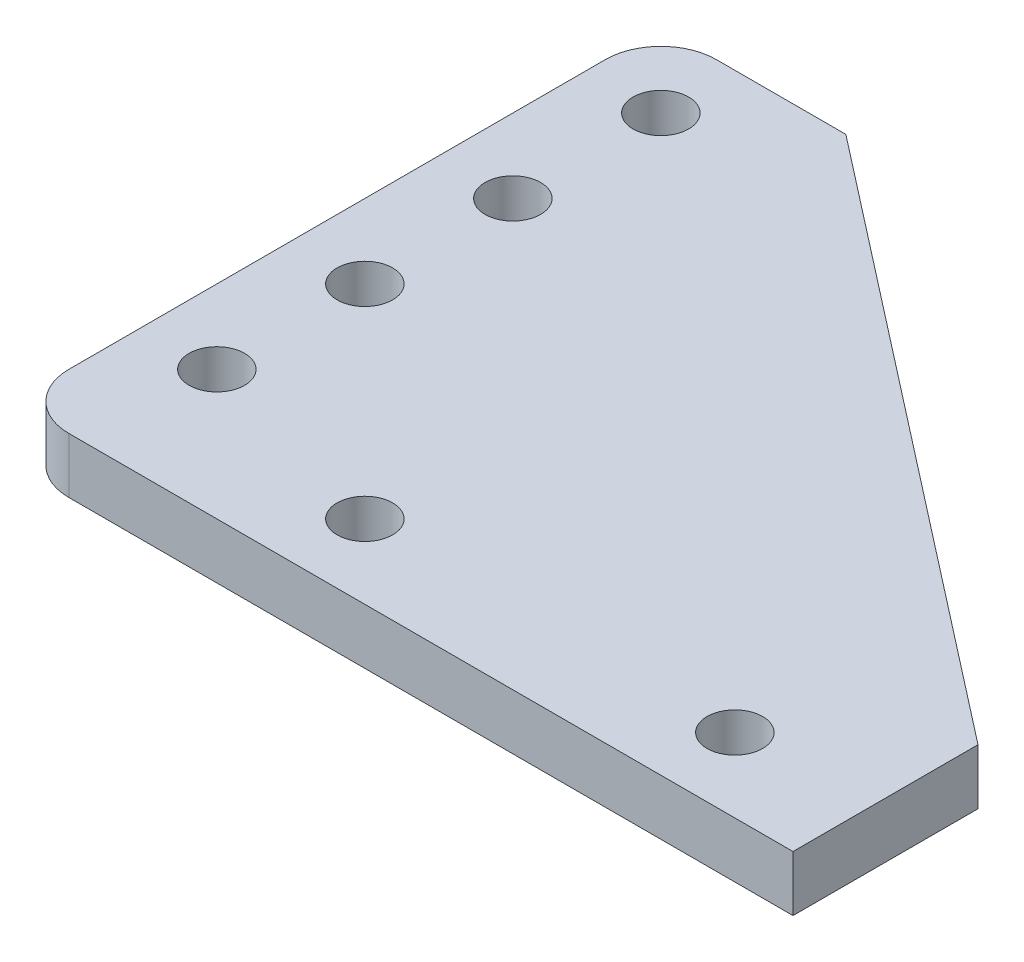
ISO-10303-21;
HEADER;
FILE_DESCRIPTION(('STEP AP214'),'2;1');
FILE_NAME('part.step','',(''),(''),'','','');
FILE_SCHEMA(('AUTOMOTIVE_DESIGN { 1 0 10303 214 1 1 1 1 }'));
ENDSEC;
DATA;
#1=APPLICATION_CONTEXT('core data for automotive mechanical design processes');
#2=APPLICATION_PROTOCOL_DEFINITION('international standard','automotive_design',2000,#1);
#3=PRODUCT_CONTEXT('',#1,'mechanical');
#4=PRODUCT('Part','Part','',(#3));
#5=PRODUCT_RELATED_PRODUCT_CATEGORY('part','',(#4));
#6=PRODUCT_DEFINITION_FORMATION('','',#4);
#7=PRODUCT_DEFINITION_CONTEXT('part definition',#1,'design');
#8=PRODUCT_DEFINITION('design','',#6,#7);
#9=PRODUCT_DEFINITION_SHAPE('','',#8);
#10=(LENGTH_UNIT() NAMED_UNIT(*) SI_UNIT(.MILLI.,.METRE.));
#11=(NAMED_UNIT(*) PLANE_ANGLE_UNIT() SI_UNIT($,.RADIAN.));
#12=(NAMED_UNIT(*) SI_UNIT($,.STERADIAN.) SOLID_ANGLE_UNIT());
#13=UNCERTAINTY_MEASURE_WITH_UNIT(LENGTH_MEASURE(1.E-05),#10,'distance_accuracy_value','');
#14=(GEOMETRIC_REPRESENTATION_CONTEXT(3) GLOBAL_UNCERTAINTY_ASSIGNED_CONTEXT((#13)) GLOBAL_UNIT_ASSIGNED_CONTEXT((#10,
#11,#12)) REPRESENTATION_CONTEXT('',''));
#15=CARTESIAN_POINT('',(0.,0.,0.));
#16=DIRECTION('',(0.,0.,1.));
#17=DIRECTION('',(1.,0.,0.));
#18=AXIS2_PLACEMENT_3D('',#15,#16,#17);
#19=CARTESIAN_POINT('',(42.1428571428571,3.,0.));
#20=DIRECTION('',(1.,0.,0.));
#21=DIRECTION('',(0.,0.,-1.));
#22=AXIS2_PLACEMENT_3D('',#19,#20,#21);
#23=PLANE('',#22);
#24=DIRECTION('',(0.,0.,1.));
#25=VECTOR('',#24,1.);
#26=CARTESIAN_POINT('',(42.1428571428571,0.,0.));
#27=LINE('',#26,#25);
#28=CARTESIAN_POINT('',(42.1428571428571,0.,-9.99999999999999));
#29=VERTEX_POINT('',#28);
#30=CARTESIAN_POINT('',(42.1428571428571,0.,0.));
#31=VERTEX_POINT('',#30);
#32=EDGE_CURVE('E110',#29,#31,#27,.T.);
#33=ORIENTED_EDGE('',*,*,#32,.F.);
#34=DIRECTION('',(0.,-1.,0.));
#35=VECTOR('',#34,1.);
#36=CARTESIAN_POINT('',(42.1428571428571,3.,-9.99999999999999));
#37=LINE('',#36,#35);
#38=CARTESIAN_POINT('',(42.1428571428571,3.,-9.99999999999999));
#39=VERTEX_POINT('',#38);
#40=EDGE_CURVE('E105',#39,#29,#37,.T.);
#41=ORIENTED_EDGE('',*,*,#40,.F.);
#42=DIRECTION('',(0.,0.,1.));
#43=VECTOR('',#42,1.);
#44=CARTESIAN_POINT('',(42.1428571428571,3.,0.));
#45=LINE('',#44,#43);
#46=CARTESIAN_POINT('',(42.1428571428571,3.,0.));
#47=VERTEX_POINT('',#46);
#48=EDGE_CURVE('E107',#39,#47,#45,.T.);
#49=ORIENTED_EDGE('',*,*,#48,.T.);
#50=DIRECTION('',(0.,-1.,0.));
#51=VECTOR('',#50,1.);
#52=CARTESIAN_POINT('',(42.1428571428571,3.,0.));
#53=LINE('',#52,#51);
#54=EDGE_CURVE('E142',#47,#31,#53,.T.);
#55=ORIENTED_EDGE('',*,*,#54,.T.);
#56=EDGE_LOOP('',(#33,#41,#49,#55));
#57=FACE_BOUND('',#56,.T.);
#58=ADVANCED_FACE('F45',(#57),#23,.T.);
#59=CARTESIAN_POINT('',(20.7307692307692,3.,-26.6538461538462));
#60=DIRECTION('',(0.61394061351492,0.,-0.789352217376326));
#61=DIRECTION('',(-0.789352217376326,0.,-0.613940613514921));
#62=AXIS2_PLACEMENT_3D('',#59,#60,#61);
#63=PLANE('',#62);
#64=DIRECTION('',(0.789352217376326,0.,0.613940613514921));
#65=VECTOR('',#64,1.);
#66=CARTESIAN_POINT('',(20.7307692307692,0.,-26.6538461538462));
#67=LINE('',#66,#65);
#68=CARTESIAN_POINT('',(10.,0.,-35.));
#69=VERTEX_POINT('',#68);
#70=EDGE_CURVE('E169',#69,#29,#67,.T.);
#71=ORIENTED_EDGE('',*,*,#70,.F.);
#72=DIRECTION('',(0.,-1.,0.));
#73=VECTOR('',#72,1.);
#74=CARTESIAN_POINT('',(10.,3.,-35.));
#75=LINE('',#74,#73);
#76=CARTESIAN_POINT('',(10.,3.,-35.));
#77=VERTEX_POINT('',#76);
#78=EDGE_CURVE('E117',#77,#69,#75,.T.);
#79=ORIENTED_EDGE('',*,*,#78,.F.);
#80=DIRECTION('',(0.789352217376326,0.,0.613940613514921));
#81=VECTOR('',#80,1.);
#82=CARTESIAN_POINT('',(20.7307692307692,3.,-26.6538461538462));
#83=LINE('',#82,#81);
#84=EDGE_CURVE('E121',#77,#39,#83,.T.);
#85=ORIENTED_EDGE('',*,*,#84,.T.);
#86=ORIENTED_EDGE('',*,*,#40,.T.);
#87=EDGE_LOOP('',(#71,#79,#85,#86));
#88=FACE_BOUND('',#87,.T.);
#89=ADVANCED_FACE('F128',(#88),#63,.T.);
#90=CARTESIAN_POINT('',(0.,3.,-35.));
#91=DIRECTION('',(0.,0.,-1.));
#92=DIRECTION('',(-1.,0.,0.));
#93=AXIS2_PLACEMENT_3D('',#90,#91,#92);
#94=PLANE('',#93);
#95=DIRECTION('',(1.,0.,0.));
#96=VECTOR('',#95,1.);
#97=CARTESIAN_POINT('',(0.,0.,-35.));
#98=LINE('',#97,#96);
#99=CARTESIAN_POINT('',(3.,0.,-35.));
#100=VERTEX_POINT('',#99);
#101=EDGE_CURVE('E172',#100,#69,#98,.T.);
#102=ORIENTED_EDGE('',*,*,#101,.F.);
#103=DIRECTION('',(0.,-1.,0.));
#104=VECTOR('',#103,1.);
#105=CARTESIAN_POINT('',(3.,3.,-35.));
#106=LINE('',#105,#104);
#107=CARTESIAN_POINT('',(3.,3.,-35.));
#108=VERTEX_POINT('',#107);
#109=EDGE_CURVE('E11',#100,#108,#106,.F.);
#110=ORIENTED_EDGE('',*,*,#109,.T.);
#111=DIRECTION('',(1.,0.,0.));
#112=VECTOR('',#111,1.);
#113=CARTESIAN_POINT('',(0.,3.,-35.));
#114=LINE('',#113,#112);
#115=EDGE_CURVE('E131',#108,#77,#114,.T.);
#116=ORIENTED_EDGE('',*,*,#115,.T.);
#117=ORIENTED_EDGE('',*,*,#78,.T.);
#118=EDGE_LOOP('',(#102,#110,#116,#117));
#119=FACE_BOUND('',#118,.T.);
#120=ADVANCED_FACE('F221',(#119),#94,.T.);
#121=CARTESIAN_POINT('',(0.,3.,0.));
#122=DIRECTION('',(-1.,0.,0.));
#123=DIRECTION('',(0.,0.,1.));
#124=AXIS2_PLACEMENT_3D('',#121,#122,#123);
#125=PLANE('',#124);
#126=DIRECTION('',(0.,0.,-1.));
#127=VECTOR('',#126,1.);
#128=CARTESIAN_POINT('',(0.,0.,0.));
#129=LINE('',#128,#127);
#130=CARTESIAN_POINT('',(0.,0.,-3.));
#131=VERTEX_POINT('',#130);
#132=CARTESIAN_POINT('',(0.,0.,-32.));
#133=VERTEX_POINT('',#132);
#134=EDGE_CURVE('E175',#131,#133,#129,.T.);
#135=ORIENTED_EDGE('',*,*,#134,.F.);
#136=DIRECTION('',(0.,-1.,0.));
#137=VECTOR('',#136,1.);
#138=CARTESIAN_POINT('',(0.,3.,-3.));
#139=LINE('',#138,#137);
#140=CARTESIAN_POINT('',(0.,3.,-3.));
#141=VERTEX_POINT('',#140);
#142=EDGE_CURVE('E201',#131,#141,#139,.F.);
#143=ORIENTED_EDGE('',*,*,#142,.T.);
#144=DIRECTION('',(0.,0.,-1.));
#145=VECTOR('',#144,1.);
#146=CARTESIAN_POINT('',(0.,3.,0.));
#147=LINE('',#146,#145);
#148=CARTESIAN_POINT('',(0.,3.,-32.));
#149=VERTEX_POINT('',#148);
#150=EDGE_CURVE('E134',#141,#149,#147,.T.);
#151=ORIENTED_EDGE('',*,*,#150,.T.);
#152=DIRECTION('',(0.,-1.,0.));
#153=VECTOR('',#152,1.);
#154=CARTESIAN_POINT('',(0.,3.,-32.));
#155=LINE('',#154,#153);
#156=EDGE_CURVE('E197',#149,#133,#155,.T.);
#157=ORIENTED_EDGE('',*,*,#156,.T.);
#158=EDGE_LOOP('',(#135,#143,#151,#157));
#159=FACE_BOUND('',#158,.T.);
#160=ADVANCED_FACE('F218',(#159),#125,.T.);
#161=CARTESIAN_POINT('',(4.,3.,-23.));
#162=DIRECTION('',(0.,-1.,0.));
#163=DIRECTION('',(0.,0.,-1.));
#164=AXIS2_PLACEMENT_3D('',#161,#162,#163);
#165=CYLINDRICAL_SURFACE('',#164,1.5);
#166=CARTESIAN_POINT('',(4.,3.,-23.));
#167=DIRECTION('',(0.,1.,0.));
#168=DIRECTION('',(0.,0.,1.));
#169=AXIS2_PLACEMENT_3D('',#166,#167,#168);
#170=CIRCLE('',#169,1.5);
#171=CARTESIAN_POINT('',(4.,3.,-21.5));
#172=VERTEX_POINT('',#171);
#173=EDGE_CURVE('E125',#172,#172,#170,.T.);
#174=ORIENTED_EDGE('',*,*,#173,.T.);
#175=EDGE_LOOP('',(#174));
#176=FACE_BOUND('',#175,.T.);
#177=CARTESIAN_POINT('',(4.,0.,-23.));
#178=DIRECTION('',(0.,1.,0.));
#179=DIRECTION('',(0.,0.,1.));
#180=AXIS2_PLACEMENT_3D('',#177,#178,#179);
#181=CIRCLE('',#180,1.5);
#182=CARTESIAN_POINT('',(4.,0.,-21.5));
#183=VERTEX_POINT('',#182);
#184=EDGE_CURVE('E163',#183,#183,#181,.T.);
#185=ORIENTED_EDGE('',*,*,#184,.F.);
#186=EDGE_LOOP('',(#185));
#187=FACE_BOUND('',#186,.T.);
#188=ADVANCED_FACE('F228',(#176,#187),#165,.F.);
#189=CARTESIAN_POINT('',(4.,3.,-15.));
#190=DIRECTION('',(0.,-1.,0.));
#191=DIRECTION('',(0.,0.,-1.));
#192=AXIS2_PLACEMENT_3D('',#189,#190,#191);
#193=CYLINDRICAL_SURFACE('',#192,1.5);
#194=CARTESIAN_POINT('',(4.,3.,-15.));
#195=DIRECTION('',(0.,1.,0.));
#196=DIRECTION('',(0.,0.,1.));
#197=AXIS2_PLACEMENT_3D('',#194,#195,#196);
#198=CIRCLE('',#197,1.5);
#199=CARTESIAN_POINT('',(4.,3.,-13.5));
#200=VERTEX_POINT('',#199);
#201=EDGE_CURVE('E419',#200,#200,#198,.T.);
#202=ORIENTED_EDGE('',*,*,#201,.T.);
#203=EDGE_LOOP('',(#202));
#204=FACE_BOUND('',#203,.T.);
#205=CARTESIAN_POINT('',(4.,0.,-15.));
#206=DIRECTION('',(0.,1.,0.));
#207=DIRECTION('',(0.,0.,1.));
#208=AXIS2_PLACEMENT_3D('',#205,#206,#207);
#209=CIRCLE('',#208,1.5);
#210=CARTESIAN_POINT('',(4.,0.,-13.5));
#211=VERTEX_POINT('',#210);
#212=EDGE_CURVE('E159',#211,#211,#209,.T.);
#213=ORIENTED_EDGE('',*,*,#212,.F.);
#214=EDGE_LOOP('',(#213));
#215=FACE_BOUND('',#214,.T.);
#216=ADVANCED_FACE('F238',(#204,#215),#193,.F.);
#217=CARTESIAN_POINT('',(15.,3.,-3.99999999999999));
#218=DIRECTION('',(0.,-1.,0.));
#219=DIRECTION('',(0.,0.,-1.));
#220=AXIS2_PLACEMENT_3D('',#217,#218,#219);
#221=CYLINDRICAL_SURFACE('',#220,1.5);
#222=CARTESIAN_POINT('',(15.,3.,-3.99999999999999));
#223=DIRECTION('',(0.,1.,0.));
#224=DIRECTION('',(0.,0.,1.));
#225=AXIS2_PLACEMENT_3D('',#222,#223,#224);
#226=CIRCLE('',#225,1.5);
#227=CARTESIAN_POINT('',(15.,3.,-2.49999999999999));
#228=VERTEX_POINT('',#227);
#229=EDGE_CURVE('E415',#228,#228,#226,.T.);
#230=ORIENTED_EDGE('',*,*,#229,.T.);
#231=EDGE_LOOP('',(#230));
#232=FACE_BOUND('',#231,.T.);
#233=CARTESIAN_POINT('',(15.,0.,-3.99999999999999));
#234=DIRECTION('',(0.,1.,0.));
#235=DIRECTION('',(0.,0.,1.));
#236=AXIS2_PLACEMENT_3D('',#233,#234,#235);
#237=CIRCLE('',#236,1.5);
#238=CARTESIAN_POINT('',(15.,0.,-2.49999999999999));
#239=VERTEX_POINT('',#238);
#240=EDGE_CURVE('E155',#239,#239,#237,.T.);
#241=ORIENTED_EDGE('',*,*,#240,.F.);
#242=EDGE_LOOP('',(#241));
#243=FACE_BOUND('',#242,.T.);
#244=ADVANCED_FACE('F242',(#232,#243),#221,.F.);
#245=CARTESIAN_POINT('',(35.,3.,-4.));
#246=DIRECTION('',(0.,-1.,0.));
#247=DIRECTION('',(0.,0.,-1.));
#248=AXIS2_PLACEMENT_3D('',#245,#246,#247);
#249=CYLINDRICAL_SURFACE('',#248,1.5);
#250=CARTESIAN_POINT('',(35.,3.,-4.));
#251=DIRECTION('',(0.,1.,0.));
#252=DIRECTION('',(0.,0.,1.));
#253=AXIS2_PLACEMENT_3D('',#250,#251,#252);
#254=CIRCLE('',#253,1.5);
#255=CARTESIAN_POINT('',(35.,3.,-2.5));
#256=VERTEX_POINT('',#255);
#257=EDGE_CURVE('E411',#256,#256,#254,.T.);
#258=ORIENTED_EDGE('',*,*,#257,.T.);
#259=EDGE_LOOP('',(#258));
#260=FACE_BOUND('',#259,.T.);
#261=CARTESIAN_POINT('',(35.,0.,-4.));
#262=DIRECTION('',(0.,1.,0.));
#263=DIRECTION('',(0.,0.,1.));
#264=AXIS2_PLACEMENT_3D('',#261,#262,#263);
#265=CIRCLE('',#264,1.5);
#266=CARTESIAN_POINT('',(35.,0.,-2.5));
#267=VERTEX_POINT('',#266);
#268=EDGE_CURVE('E151',#267,#267,#265,.T.);
#269=ORIENTED_EDGE('',*,*,#268,.F.);
#270=EDGE_LOOP('',(#269));
#271=FACE_BOUND('',#270,.T.);
#272=ADVANCED_FACE('F246',(#260,#271),#249,.F.);
#273=CARTESIAN_POINT('',(4.,3.,-7.));
#274=DIRECTION('',(0.,-1.,0.));
#275=DIRECTION('',(0.,0.,-1.));
#276=AXIS2_PLACEMENT_3D('',#273,#274,#275);
#277=CYLINDRICAL_SURFACE('',#276,1.5);
#278=CARTESIAN_POINT('',(4.,3.,-7.));
#279=DIRECTION('',(0.,1.,0.));
#280=DIRECTION('',(0.,0.,1.));
#281=AXIS2_PLACEMENT_3D('',#278,#279,#280);
#282=CIRCLE('',#281,1.5);
#283=CARTESIAN_POINT('',(4.,3.,-5.5));
#284=VERTEX_POINT('',#283);
#285=EDGE_CURVE('E407',#284,#284,#282,.T.);
#286=ORIENTED_EDGE('',*,*,#285,.T.);
#287=EDGE_LOOP('',(#286));
#288=FACE_BOUND('',#287,.T.);
#289=CARTESIAN_POINT('',(4.,0.,-7.));
#290=DIRECTION('',(0.,1.,0.));
#291=DIRECTION('',(0.,0.,1.));
#292=AXIS2_PLACEMENT_3D('',#289,#290,#291);
#293=CIRCLE('',#292,1.5);
#294=CARTESIAN_POINT('',(4.,0.,-5.5));
#295=VERTEX_POINT('',#294);
#296=EDGE_CURVE('E147',#295,#295,#293,.T.);
#297=ORIENTED_EDGE('',*,*,#296,.F.);
#298=EDGE_LOOP('',(#297));
#299=FACE_BOUND('',#298,.T.);
#300=ADVANCED_FACE('F250',(#288,#299),#277,.F.);
#301=CARTESIAN_POINT('',(4.,3.,-31.));
#302=DIRECTION('',(0.,-1.,0.));
#303=DIRECTION('',(0.,0.,-1.));
#304=AXIS2_PLACEMENT_3D('',#301,#302,#303);
#305=CYLINDRICAL_SURFACE('',#304,1.5);
#306=CARTESIAN_POINT('',(4.,3.,-31.));
#307=DIRECTION('',(0.,1.,0.));
#308=DIRECTION('',(0.,0.,1.));
#309=AXIS2_PLACEMENT_3D('',#306,#307,#308);
#310=CIRCLE('',#309,1.5);
#311=CARTESIAN_POINT('',(4.,3.,-29.5));
#312=VERTEX_POINT('',#311);
#313=EDGE_CURVE('E183',#312,#312,#310,.T.);
#314=ORIENTED_EDGE('',*,*,#313,.T.);
#315=EDGE_LOOP('',(#314));
#316=FACE_BOUND('',#315,.T.);
#317=CARTESIAN_POINT('',(4.,0.,-31.));
#318=DIRECTION('',(0.,1.,0.));
#319=DIRECTION('',(0.,0.,1.));
#320=AXIS2_PLACEMENT_3D('',#317,#318,#319);
#321=CIRCLE('',#320,1.5);
#322=CARTESIAN_POINT('',(4.,0.,-29.5));
#323=VERTEX_POINT('',#322);
#324=EDGE_CURVE('E143',#323,#323,#321,.T.);
#325=ORIENTED_EDGE('',*,*,#324,.F.);
#326=EDGE_LOOP('',(#325));
#327=FACE_BOUND('',#326,.T.);
#328=ADVANCED_FACE('F254',(#316,#327),#305,.F.);
#329=CARTESIAN_POINT('',(0.,3.,0.));
#330=DIRECTION('',(0.,0.,1.));
#331=DIRECTION('',(1.,0.,0.));
#332=AXIS2_PLACEMENT_3D('',#329,#330,#331);
#333=PLANE('',#332);
#334=DIRECTION('',(-1.,0.,0.));
#335=VECTOR('',#334,1.);
#336=CARTESIAN_POINT('',(0.,3.,0.));
#337=LINE('',#336,#335);
#338=CARTESIAN_POINT('',(3.,3.,0.));
#339=VERTEX_POINT('',#338);
#340=EDGE_CURVE('E123',#47,#339,#337,.T.);
#341=ORIENTED_EDGE('',*,*,#340,.T.);
#342=DIRECTION('',(0.,-1.,0.));
#343=VECTOR('',#342,1.);
#344=CARTESIAN_POINT('',(3.,3.,0.));
#345=LINE('',#344,#343);
#346=CARTESIAN_POINT('',(3.,0.,0.));
#347=VERTEX_POINT('',#346);
#348=EDGE_CURVE('E116',#339,#347,#345,.T.);
#349=ORIENTED_EDGE('',*,*,#348,.T.);
#350=DIRECTION('',(-1.,0.,0.));
#351=VECTOR('',#350,1.);
#352=CARTESIAN_POINT('',(0.,0.,0.));
#353=LINE('',#352,#351);
#354=EDGE_CURVE('E179',#31,#347,#353,.T.);
#355=ORIENTED_EDGE('',*,*,#354,.F.);
#356=ORIENTED_EDGE('',*,*,#54,.F.);
#357=EDGE_LOOP('',(#341,#349,#355,#356));
#358=FACE_BOUND('',#357,.T.);
#359=ADVANCED_FACE('F211',(#358),#333,.T.);
#360=CARTESIAN_POINT('',(0.,3.,0.));
#361=DIRECTION('',(0.,1.,0.));
#362=DIRECTION('',(0.,0.,1.));
#363=AXIS2_PLACEMENT_3D('',#360,#361,#362);
#364=PLANE('',#363);
#365=ORIENTED_EDGE('',*,*,#313,.F.);
#366=EDGE_LOOP('',(#365));
#367=FACE_BOUND('',#366,.T.);
#368=ORIENTED_EDGE('',*,*,#285,.F.);
#369=EDGE_LOOP('',(#368));
#370=FACE_BOUND('',#369,.T.);
#371=ORIENTED_EDGE('',*,*,#257,.F.);
#372=EDGE_LOOP('',(#371));
#373=FACE_BOUND('',#372,.T.);
#374=ORIENTED_EDGE('',*,*,#229,.F.);
#375=EDGE_LOOP('',(#374));
#376=FACE_BOUND('',#375,.T.);
#377=ORIENTED_EDGE('',*,*,#201,.F.);
#378=EDGE_LOOP('',(#377));
#379=FACE_BOUND('',#378,.T.);
#380=ORIENTED_EDGE('',*,*,#173,.F.);
#381=EDGE_LOOP('',(#380));
#382=FACE_BOUND('',#381,.T.);
#383=ORIENTED_EDGE('',*,*,#150,.F.);
#384=CARTESIAN_POINT('',(3.,3.,-3.));
#385=DIRECTION('',(0.,1.,0.));
#386=DIRECTION('',(0.,0.,1.));
#387=AXIS2_PLACEMENT_3D('',#384,#385,#386);
#388=CIRCLE('',#387,3.);
#389=EDGE_CURVE('E54',#141,#339,#388,.T.);
#390=ORIENTED_EDGE('',*,*,#389,.T.);
#391=ORIENTED_EDGE('',*,*,#340,.F.);
#392=ORIENTED_EDGE('',*,*,#48,.F.);
#393=ORIENTED_EDGE('',*,*,#84,.F.);
#394=ORIENTED_EDGE('',*,*,#115,.F.);
#395=CARTESIAN_POINT('',(3.,3.,-32.));
#396=DIRECTION('',(0.,1.,0.));
#397=DIRECTION('',(0.,0.,1.));
#398=AXIS2_PLACEMENT_3D('',#395,#396,#397);
#399=CIRCLE('',#398,3.);
#400=EDGE_CURVE('E66',#108,#149,#399,.T.);
#401=ORIENTED_EDGE('',*,*,#400,.T.);
#402=EDGE_LOOP('',(#383,#390,#391,#392,#393,#394,#401));
#403=FACE_BOUND('',#402,.T.);
#404=ADVANCED_FACE('F120',(#367,#370,#373,#376,#379,#382,#403),#364,.T.);
#405=CARTESIAN_POINT('',(0.,0.,0.));
#406=DIRECTION('',(0.,1.,0.));
#407=DIRECTION('',(0.,0.,1.));
#408=AXIS2_PLACEMENT_3D('',#405,#406,#407);
#409=PLANE('',#408);
#410=ORIENTED_EDGE('',*,*,#324,.T.);
#411=EDGE_LOOP('',(#410));
#412=FACE_BOUND('',#411,.T.);
#413=ORIENTED_EDGE('',*,*,#296,.T.);
#414=EDGE_LOOP('',(#413));
#415=FACE_BOUND('',#414,.T.);
#416=ORIENTED_EDGE('',*,*,#268,.T.);
#417=EDGE_LOOP('',(#416));
#418=FACE_BOUND('',#417,.T.);
#419=ORIENTED_EDGE('',*,*,#240,.T.);
#420=EDGE_LOOP('',(#419));
#421=FACE_BOUND('',#420,.T.);
#422=ORIENTED_EDGE('',*,*,#212,.T.);
#423=EDGE_LOOP('',(#422));
#424=FACE_BOUND('',#423,.T.);
#425=ORIENTED_EDGE('',*,*,#184,.T.);
#426=EDGE_LOOP('',(#425));
#427=FACE_BOUND('',#426,.T.);
#428=ORIENTED_EDGE('',*,*,#354,.T.);
#429=CARTESIAN_POINT('',(3.,0.,-3.));
#430=DIRECTION('',(0.,1.,0.));
#431=DIRECTION('',(0.,0.,1.));
#432=AXIS2_PLACEMENT_3D('',#429,#430,#431);
#433=CIRCLE('',#432,3.);
#434=EDGE_CURVE('E194',#347,#131,#433,.F.);
#435=ORIENTED_EDGE('',*,*,#434,.T.);
#436=ORIENTED_EDGE('',*,*,#134,.T.);
#437=CARTESIAN_POINT('',(3.,0.,-32.));
#438=DIRECTION('',(0.,1.,0.));
#439=DIRECTION('',(0.,0.,1.));
#440=AXIS2_PLACEMENT_3D('',#437,#438,#439);
#441=CIRCLE('',#440,3.);
#442=EDGE_CURVE('E191',#133,#100,#441,.F.);
#443=ORIENTED_EDGE('',*,*,#442,.T.);
#444=ORIENTED_EDGE('',*,*,#101,.T.);
#445=ORIENTED_EDGE('',*,*,#70,.T.);
#446=ORIENTED_EDGE('',*,*,#32,.T.);
#447=EDGE_LOOP('',(#428,#435,#436,#443,#444,#445,#446));
#448=FACE_BOUND('',#447,.T.);
#449=ADVANCED_FACE('F216',(#412,#415,#418,#421,#424,#427,#448),#409,.F.);
#450=CARTESIAN_POINT('',(3.,3.,-3.));
#451=DIRECTION('',(0.,-1.,0.));
#452=DIRECTION('',(0.,0.,-1.));
#453=AXIS2_PLACEMENT_3D('',#450,#451,#452);
#454=CYLINDRICAL_SURFACE('',#453,3.);
#455=ORIENTED_EDGE('',*,*,#389,.F.);
#456=ORIENTED_EDGE('',*,*,#142,.F.);
#457=ORIENTED_EDGE('',*,*,#434,.F.);
#458=ORIENTED_EDGE('',*,*,#348,.F.);
#459=EDGE_LOOP('',(#455,#456,#457,#458));
#460=FACE_BOUND('',#459,.T.);
#461=ADVANCED_FACE('F213',(#460),#454,.T.);
#462=CARTESIAN_POINT('',(3.,3.,-32.));
#463=DIRECTION('',(0.,-1.,0.));
#464=DIRECTION('',(0.,0.,-1.));
#465=AXIS2_PLACEMENT_3D('',#462,#463,#464);
#466=CYLINDRICAL_SURFACE('',#465,3.);
#467=ORIENTED_EDGE('',*,*,#400,.F.);
#468=ORIENTED_EDGE('',*,*,#109,.F.);
#469=ORIENTED_EDGE('',*,*,#442,.F.);
#470=ORIENTED_EDGE('',*,*,#156,.F.);
#471=EDGE_LOOP('',(#467,#468,#469,#470));
#472=FACE_BOUND('',#471,.T.);
#473=ADVANCED_FACE('F47',(#472),#466,.T.);
#474=CLOSED_SHELL('',(#58,#89,#120,#160,#188,#216,#244,#272,#300,#328,#359,#404,#449,#461,#473));
#475=MANIFOLD_SOLID_BREP('B2',#474);
#476=ADVANCED_BREP_SHAPE_REPRESENTATION('',(#18,#475),#14);
#477=SHAPE_DEFINITION_REPRESENTATION(#9,#476);
ENDSEC;
END-ISO-10303-21;
